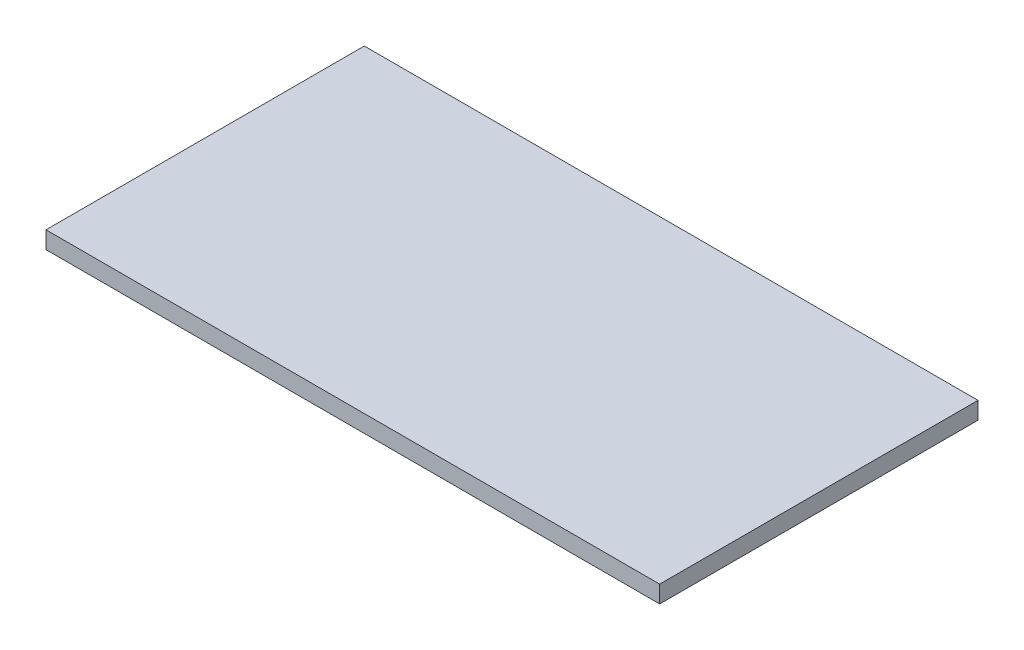
ISO-10303-21;
HEADER;
FILE_DESCRIPTION(('STEP AP214'),'2;1');
FILE_NAME('part.step','',(''),(''),'','','');
FILE_SCHEMA(('AUTOMOTIVE_DESIGN { 1 0 10303 214 1 1 1 1 }'));
ENDSEC;
DATA;
#1=APPLICATION_CONTEXT('core data for automotive mechanical design processes');
#2=APPLICATION_PROTOCOL_DEFINITION('international standard','automotive_design',2000,#1);
#3=PRODUCT_CONTEXT('',#1,'mechanical');
#4=PRODUCT('Part','Part','',(#3));
#5=PRODUCT_RELATED_PRODUCT_CATEGORY('part','',(#4));
#6=PRODUCT_DEFINITION_FORMATION('','',#4);
#7=PRODUCT_DEFINITION_CONTEXT('part definition',#1,'design');
#8=PRODUCT_DEFINITION('design','',#6,#7);
#9=PRODUCT_DEFINITION_SHAPE('','',#8);
#10=(LENGTH_UNIT() NAMED_UNIT(*) SI_UNIT(.MILLI.,.METRE.));
#11=(NAMED_UNIT(*) PLANE_ANGLE_UNIT() SI_UNIT($,.RADIAN.));
#12=(NAMED_UNIT(*) SI_UNIT($,.STERADIAN.) SOLID_ANGLE_UNIT());
#13=UNCERTAINTY_MEASURE_WITH_UNIT(LENGTH_MEASURE(1.E-05),#10,'distance_accuracy_value','');
#14=(GEOMETRIC_REPRESENTATION_CONTEXT(3) GLOBAL_UNCERTAINTY_ASSIGNED_CONTEXT((#13)) GLOBAL_UNIT_ASSIGNED_CONTEXT((#10,
#11,#12)) REPRESENTATION_CONTEXT('',''));
#15=CARTESIAN_POINT('',(0.,0.,0.));
#16=DIRECTION('',(0.,0.,1.));
#17=DIRECTION('',(1.,0.,0.));
#18=AXIS2_PLACEMENT_3D('',#15,#16,#17);
#19=CARTESIAN_POINT('',(0.,6.,0.));
#20=DIRECTION('',(1.,0.,0.));
#21=DIRECTION('',(0.,0.,-1.));
#22=AXIS2_PLACEMENT_3D('',#19,#20,#21);
#23=PLANE('',#22);
#24=DIRECTION('',(0.,0.,1.));
#25=VECTOR('',#24,1.);
#26=CARTESIAN_POINT('',(0.,0.,0.));
#27=LINE('',#26,#25);
#28=CARTESIAN_POINT('',(0.,0.,-111.));
#29=VERTEX_POINT('',#28);
#30=CARTESIAN_POINT('',(0.,0.,0.));
#31=VERTEX_POINT('',#30);
#32=EDGE_CURVE('E96',#29,#31,#27,.T.);
#33=ORIENTED_EDGE('',*,*,#32,.T.);
#34=DIRECTION('',(0.,-1.,0.));
#35=VECTOR('',#34,1.);
#36=CARTESIAN_POINT('',(0.,6.,0.));
#37=LINE('',#36,#35);
#38=CARTESIAN_POINT('',(0.,6.,0.));
#39=VERTEX_POINT('',#38);
#40=EDGE_CURVE('E11',#39,#31,#37,.T.);
#41=ORIENTED_EDGE('',*,*,#40,.F.);
#42=DIRECTION('',(0.,0.,1.));
#43=VECTOR('',#42,1.);
#44=CARTESIAN_POINT('',(0.,6.,0.));
#45=LINE('',#44,#43);
#46=CARTESIAN_POINT('',(0.,6.,-111.));
#47=VERTEX_POINT('',#46);
#48=EDGE_CURVE('E84',#47,#39,#45,.T.);
#49=ORIENTED_EDGE('',*,*,#48,.F.);
#50=DIRECTION('',(0.,-1.,0.));
#51=VECTOR('',#50,1.);
#52=CARTESIAN_POINT('',(0.,6.,-111.));
#53=LINE('',#52,#51);
#54=EDGE_CURVE('E92',#47,#29,#53,.T.);
#55=ORIENTED_EDGE('',*,*,#54,.T.);
#56=EDGE_LOOP('',(#33,#41,#49,#55));
#57=FACE_BOUND('',#56,.T.);
#58=ADVANCED_FACE('F33',(#57),#23,.F.);
#59=CARTESIAN_POINT('',(0.,6.,0.));
#60=DIRECTION('',(0.,0.,-1.));
#61=DIRECTION('',(-1.,0.,0.));
#62=AXIS2_PLACEMENT_3D('',#59,#60,#61);
#63=PLANE('',#62);
#64=DIRECTION('',(1.,0.,0.));
#65=VECTOR('',#64,1.);
#66=CARTESIAN_POINT('',(0.,0.,0.));
#67=LINE('',#66,#65);
#68=CARTESIAN_POINT('',(214.,0.,0.));
#69=VERTEX_POINT('',#68);
#70=EDGE_CURVE('E88',#31,#69,#67,.T.);
#71=ORIENTED_EDGE('',*,*,#70,.T.);
#72=DIRECTION('',(0.,-1.,0.));
#73=VECTOR('',#72,1.);
#74=CARTESIAN_POINT('',(214.,6.,0.));
#75=LINE('',#74,#73);
#76=CARTESIAN_POINT('',(214.,6.,0.));
#77=VERTEX_POINT('',#76);
#78=EDGE_CURVE('E41',#77,#69,#75,.T.);
#79=ORIENTED_EDGE('',*,*,#78,.F.);
#80=DIRECTION('',(1.,0.,0.));
#81=VECTOR('',#80,1.);
#82=CARTESIAN_POINT('',(0.,6.,0.));
#83=LINE('',#82,#81);
#84=EDGE_CURVE('E79',#39,#77,#83,.T.);
#85=ORIENTED_EDGE('',*,*,#84,.F.);
#86=ORIENTED_EDGE('',*,*,#40,.T.);
#87=EDGE_LOOP('',(#71,#79,#85,#86));
#88=FACE_BOUND('',#87,.T.);
#89=ADVANCED_FACE('F87',(#88),#63,.F.);
#90=CARTESIAN_POINT('',(214.,6.,0.));
#91=DIRECTION('',(-1.,0.,0.));
#92=DIRECTION('',(0.,0.,1.));
#93=AXIS2_PLACEMENT_3D('',#90,#91,#92);
#94=PLANE('',#93);
#95=DIRECTION('',(0.,0.,-1.));
#96=VECTOR('',#95,1.);
#97=CARTESIAN_POINT('',(214.,0.,0.));
#98=LINE('',#97,#96);
#99=CARTESIAN_POINT('',(214.,0.,-111.));
#100=VERTEX_POINT('',#99);
#101=EDGE_CURVE('E66',#69,#100,#98,.T.);
#102=ORIENTED_EDGE('',*,*,#101,.T.);
#103=DIRECTION('',(0.,-1.,0.));
#104=VECTOR('',#103,1.);
#105=CARTESIAN_POINT('',(214.,6.,-111.));
#106=LINE('',#105,#104);
#107=CARTESIAN_POINT('',(214.,6.,-111.));
#108=VERTEX_POINT('',#107);
#109=EDGE_CURVE('E89',#108,#100,#106,.T.);
#110=ORIENTED_EDGE('',*,*,#109,.F.);
#111=DIRECTION('',(0.,0.,-1.));
#112=VECTOR('',#111,1.);
#113=CARTESIAN_POINT('',(214.,6.,0.));
#114=LINE('',#113,#112);
#115=EDGE_CURVE('E82',#77,#108,#114,.T.);
#116=ORIENTED_EDGE('',*,*,#115,.F.);
#117=ORIENTED_EDGE('',*,*,#78,.T.);
#118=EDGE_LOOP('',(#102,#110,#116,#117));
#119=FACE_BOUND('',#118,.T.);
#120=ADVANCED_FACE('F90',(#119),#94,.F.);
#121=CARTESIAN_POINT('',(0.,6.,-111.));
#122=DIRECTION('',(0.,0.,1.));
#123=DIRECTION('',(1.,0.,0.));
#124=AXIS2_PLACEMENT_3D('',#121,#122,#123);
#125=PLANE('',#124);
#126=DIRECTION('',(-1.,0.,0.));
#127=VECTOR('',#126,1.);
#128=CARTESIAN_POINT('',(0.,0.,-111.));
#129=LINE('',#128,#127);
#130=EDGE_CURVE('E72',#100,#29,#129,.T.);
#131=ORIENTED_EDGE('',*,*,#130,.T.);
#132=ORIENTED_EDGE('',*,*,#54,.F.);
#133=DIRECTION('',(-1.,0.,0.));
#134=VECTOR('',#133,1.);
#135=CARTESIAN_POINT('',(0.,6.,-111.));
#136=LINE('',#135,#134);
#137=EDGE_CURVE('E49',#108,#47,#136,.T.);
#138=ORIENTED_EDGE('',*,*,#137,.F.);
#139=ORIENTED_EDGE('',*,*,#109,.T.);
#140=EDGE_LOOP('',(#131,#132,#138,#139));
#141=FACE_BOUND('',#140,.T.);
#142=ADVANCED_FACE('F103',(#141),#125,.F.);
#143=CARTESIAN_POINT('',(0.,6.,0.));
#144=DIRECTION('',(0.,-1.,0.));
#145=DIRECTION('',(0.,0.,-1.));
#146=AXIS2_PLACEMENT_3D('',#143,#144,#145);
#147=PLANE('',#146);
#148=ORIENTED_EDGE('',*,*,#48,.T.);
#149=ORIENTED_EDGE('',*,*,#84,.T.);
#150=ORIENTED_EDGE('',*,*,#115,.T.);
#151=ORIENTED_EDGE('',*,*,#137,.T.);
#152=EDGE_LOOP('',(#148,#149,#150,#151));
#153=FACE_BOUND('',#152,.T.);
#154=ADVANCED_FACE('F80',(#153),#147,.F.);
#155=CARTESIAN_POINT('',(0.,0.,0.));
#156=DIRECTION('',(0.,-1.,0.));
#157=DIRECTION('',(0.,0.,-1.));
#158=AXIS2_PLACEMENT_3D('',#155,#156,#157);
#159=PLANE('',#158);
#160=ORIENTED_EDGE('',*,*,#32,.F.);
#161=ORIENTED_EDGE('',*,*,#130,.F.);
#162=ORIENTED_EDGE('',*,*,#101,.F.);
#163=ORIENTED_EDGE('',*,*,#70,.F.);
#164=EDGE_LOOP('',(#160,#161,#162,#163));
#165=FACE_BOUND('',#164,.T.);
#166=ADVANCED_FACE('F106',(#165),#159,.T.);
#167=CLOSED_SHELL('',(#58,#89,#120,#142,#154,#166));
#168=MANIFOLD_SOLID_BREP('B2',#167);
#169=ADVANCED_BREP_SHAPE_REPRESENTATION('',(#18,#168),#14);
#170=SHAPE_DEFINITION_REPRESENTATION(#9,#169);
ENDSEC;
END-ISO-10303-21;
